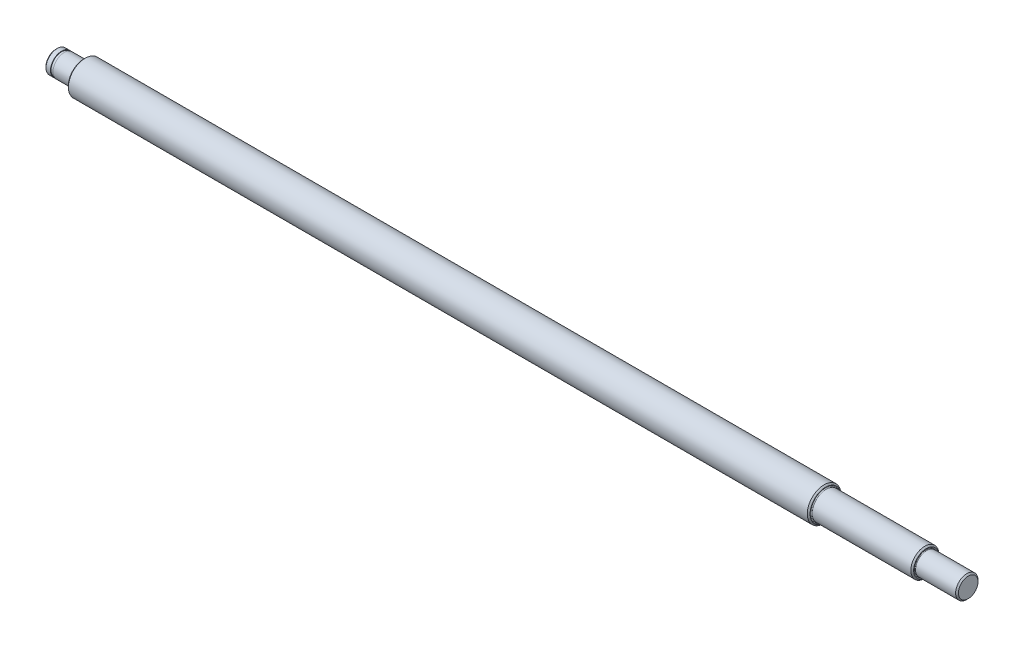
ISO-10303-21;
HEADER;
FILE_DESCRIPTION(('STEP AP214'),'2;1');
FILE_NAME('part.step','',(''),(''),'','','');
FILE_SCHEMA(('AUTOMOTIVE_DESIGN { 1 0 10303 214 1 1 1 1 }'));
ENDSEC;
DATA;
#1=APPLICATION_CONTEXT('core data for automotive mechanical design processes');
#2=APPLICATION_PROTOCOL_DEFINITION('international standard','automotive_design',2000,#1);
#3=PRODUCT_CONTEXT('',#1,'mechanical');
#4=PRODUCT('Part','Part','',(#3));
#5=PRODUCT_RELATED_PRODUCT_CATEGORY('part','',(#4));
#6=PRODUCT_DEFINITION_FORMATION('','',#4);
#7=PRODUCT_DEFINITION_CONTEXT('part definition',#1,'design');
#8=PRODUCT_DEFINITION('design','',#6,#7);
#9=PRODUCT_DEFINITION_SHAPE('','',#8);
#10=(LENGTH_UNIT() NAMED_UNIT(*) SI_UNIT(.MILLI.,.METRE.));
#11=(NAMED_UNIT(*) PLANE_ANGLE_UNIT() SI_UNIT($,.RADIAN.));
#12=(NAMED_UNIT(*) SI_UNIT($,.STERADIAN.) SOLID_ANGLE_UNIT());
#13=UNCERTAINTY_MEASURE_WITH_UNIT(LENGTH_MEASURE(1.E-05),#10,'distance_accuracy_value','');
#14=(GEOMETRIC_REPRESENTATION_CONTEXT(3) GLOBAL_UNCERTAINTY_ASSIGNED_CONTEXT((#13)) GLOBAL_UNIT_ASSIGNED_CONTEXT((#10,
#11,#12)) REPRESENTATION_CONTEXT('',''));
#15=CARTESIAN_POINT('',(0.,0.,0.));
#16=DIRECTION('',(0.,0.,1.));
#17=DIRECTION('',(1.,0.,0.));
#18=AXIS2_PLACEMENT_3D('',#15,#16,#17);
#19=CARTESIAN_POINT('',(0.500000000000004,0.,0.));
#20=DIRECTION('',(1.,0.,0.));
#21=DIRECTION('',(0.,0.,-1.));
#22=AXIS2_PLACEMENT_3D('',#19,#20,#21);
#23=CONICAL_SURFACE('',#22,4.,0.785398163397416);
#24=CARTESIAN_POINT('',(0.,0.,0.));
#25=DIRECTION('',(-1.,0.,0.));
#26=DIRECTION('',(0.,0.,1.));
#27=AXIS2_PLACEMENT_3D('',#24,#25,#26);
#28=CIRCLE('',#27,3.50000000000003);
#29=CARTESIAN_POINT('',(0.,0.,3.50000000000003));
#30=VERTEX_POINT('',#29);
#31=EDGE_CURVE('E104',#30,#30,#28,.T.);
#32=ORIENTED_EDGE('',*,*,#31,.F.);
#33=EDGE_LOOP('',(#32));
#34=FACE_BOUND('',#33,.T.);
#35=CARTESIAN_POINT('',(0.500000000000004,0.,0.));
#36=DIRECTION('',(-1.,0.,0.));
#37=DIRECTION('',(0.,0.,1.));
#38=AXIS2_PLACEMENT_3D('',#35,#36,#37);
#39=CIRCLE('',#38,4.);
#40=CARTESIAN_POINT('',(0.500000000000004,0.,4.));
#41=VERTEX_POINT('',#40);
#42=EDGE_CURVE('E10',#41,#41,#39,.T.);
#43=ORIENTED_EDGE('',*,*,#42,.T.);
#44=EDGE_LOOP('',(#43));
#45=FACE_BOUND('',#44,.T.);
#46=ADVANCED_FACE('F40',(#34,#45),#23,.T.);
#47=CARTESIAN_POINT('',(-20.,0.,0.));
#48=DIRECTION('',(-1.,0.,0.));
#49=DIRECTION('',(0.,0.,1.));
#50=AXIS2_PLACEMENT_3D('',#47,#48,#49);
#51=CYLINDRICAL_SURFACE('',#50,4.);
#52=ORIENTED_EDGE('',*,*,#42,.F.);
#53=EDGE_LOOP('',(#52));
#54=FACE_BOUND('',#53,.T.);
#55=CARTESIAN_POINT('',(2.10000000000001,0.,0.));
#56=DIRECTION('',(-1.,0.,0.));
#57=DIRECTION('',(0.,0.,1.));
#58=AXIS2_PLACEMENT_3D('',#55,#56,#57);
#59=CIRCLE('',#58,4.);
#60=CARTESIAN_POINT('',(2.10000000000001,0.,4.));
#61=VERTEX_POINT('',#60);
#62=EDGE_CURVE('E46',#61,#61,#59,.T.);
#63=ORIENTED_EDGE('',*,*,#62,.T.);
#64=EDGE_LOOP('',(#63));
#65=FACE_BOUND('',#64,.T.);
#66=ADVANCED_FACE('F111',(#54,#65),#51,.T.);
#67=CARTESIAN_POINT('',(2.10000000000001,4.,0.));
#68=DIRECTION('',(-1.,0.,0.));
#69=DIRECTION('',(0.,0.,1.));
#70=AXIS2_PLACEMENT_3D('',#67,#68,#69);
#71=PLANE('',#70);
#72=ORIENTED_EDGE('',*,*,#62,.F.);
#73=EDGE_LOOP('',(#72));
#74=FACE_BOUND('',#73,.T.);
#75=CARTESIAN_POINT('',(2.10000000000001,0.,0.));
#76=DIRECTION('',(-1.,0.,0.));
#77=DIRECTION('',(0.,0.,1.));
#78=AXIS2_PLACEMENT_3D('',#75,#76,#77);
#79=CIRCLE('',#78,3.8);
#80=CARTESIAN_POINT('',(2.10000000000001,0.,3.8));
#81=VERTEX_POINT('',#80);
#82=EDGE_CURVE('E50',#81,#81,#79,.T.);
#83=ORIENTED_EDGE('',*,*,#82,.T.);
#84=EDGE_LOOP('',(#83));
#85=FACE_BOUND('',#84,.T.);
#86=ADVANCED_FACE('F115',(#74,#85),#71,.F.);
#87=CARTESIAN_POINT('',(-20.,0.,0.));
#88=DIRECTION('',(-1.,0.,0.));
#89=DIRECTION('',(0.,0.,1.));
#90=AXIS2_PLACEMENT_3D('',#87,#88,#89);
#91=CYLINDRICAL_SURFACE('',#90,3.8);
#92=ORIENTED_EDGE('',*,*,#82,.F.);
#93=EDGE_LOOP('',(#92));
#94=FACE_BOUND('',#93,.T.);
#95=CARTESIAN_POINT('',(3.00000000000001,0.,0.));
#96=DIRECTION('',(-1.,0.,0.));
#97=DIRECTION('',(0.,0.,1.));
#98=AXIS2_PLACEMENT_3D('',#95,#96,#97);
#99=CIRCLE('',#98,3.8);
#100=CARTESIAN_POINT('',(3.00000000000001,0.,3.8));
#101=VERTEX_POINT('',#100);
#102=EDGE_CURVE('E54',#101,#101,#99,.T.);
#103=ORIENTED_EDGE('',*,*,#102,.T.);
#104=EDGE_LOOP('',(#103));
#105=FACE_BOUND('',#104,.T.);
#106=ADVANCED_FACE('F120',(#94,#105),#91,.T.);
#107=CARTESIAN_POINT('',(3.00000000000001,4.,0.));
#108=DIRECTION('',(1.,0.,0.));
#109=DIRECTION('',(0.,0.,-1.));
#110=AXIS2_PLACEMENT_3D('',#107,#108,#109);
#111=PLANE('',#110);
#112=ORIENTED_EDGE('',*,*,#102,.F.);
#113=EDGE_LOOP('',(#112));
#114=FACE_BOUND('',#113,.T.);
#115=CARTESIAN_POINT('',(3.00000000000001,0.,0.));
#116=DIRECTION('',(-1.,0.,0.));
#117=DIRECTION('',(0.,0.,1.));
#118=AXIS2_PLACEMENT_3D('',#115,#116,#117);
#119=CIRCLE('',#118,4.);
#120=CARTESIAN_POINT('',(3.00000000000001,0.,4.));
#121=VERTEX_POINT('',#120);
#122=EDGE_CURVE('E59',#121,#121,#119,.T.);
#123=ORIENTED_EDGE('',*,*,#122,.T.);
#124=EDGE_LOOP('',(#123));
#125=FACE_BOUND('',#124,.T.);
#126=ADVANCED_FACE('F126',(#114,#125),#111,.F.);
#127=CARTESIAN_POINT('',(-20.,0.,0.));
#128=DIRECTION('',(-1.,0.,0.));
#129=DIRECTION('',(0.,0.,1.));
#130=AXIS2_PLACEMENT_3D('',#127,#128,#129);
#131=CYLINDRICAL_SURFACE('',#130,4.);
#132=ORIENTED_EDGE('',*,*,#122,.F.);
#133=EDGE_LOOP('',(#132));
#134=FACE_BOUND('',#133,.T.);
#135=CARTESIAN_POINT('',(9.70000000000001,0.,0.));
#136=DIRECTION('',(-1.,0.,0.));
#137=DIRECTION('',(0.,0.,1.));
#138=AXIS2_PLACEMENT_3D('',#135,#136,#137);
#139=CIRCLE('',#138,4.);
#140=CARTESIAN_POINT('',(9.70000000000001,0.,4.));
#141=VERTEX_POINT('',#140);
#142=EDGE_CURVE('E62',#141,#141,#139,.T.);
#143=ORIENTED_EDGE('',*,*,#142,.T.);
#144=EDGE_LOOP('',(#143));
#145=FACE_BOUND('',#144,.T.);
#146=ADVANCED_FACE('F130',(#134,#145),#131,.T.);
#147=CARTESIAN_POINT('',(9.70000000000001,0.,0.));
#148=DIRECTION('',(-1.,0.,0.));
#149=DIRECTION('',(0.,0.,1.));
#150=AXIS2_PLACEMENT_3D('',#147,#148,#149);
#151=TOROIDAL_SURFACE('',#150,4.3,0.3);
#152=ORIENTED_EDGE('',*,*,#142,.F.);
#153=EDGE_LOOP('',(#152));
#154=FACE_BOUND('',#153,.T.);
#155=CARTESIAN_POINT('',(10.,0.,0.));
#156=DIRECTION('',(-1.,0.,0.));
#157=DIRECTION('',(0.,0.,1.));
#158=AXIS2_PLACEMENT_3D('',#155,#156,#157);
#159=CIRCLE('',#158,4.3);
#160=CARTESIAN_POINT('',(10.,0.,4.3));
#161=VERTEX_POINT('',#160);
#162=EDGE_CURVE('E65',#161,#161,#159,.T.);
#163=ORIENTED_EDGE('',*,*,#162,.T.);
#164=EDGE_LOOP('',(#163));
#165=FACE_BOUND('',#164,.T.);
#166=ADVANCED_FACE('F134',(#154,#165),#151,.F.);
#167=CARTESIAN_POINT('',(10.,5.50000000000002,0.));
#168=DIRECTION('',(1.,0.,0.));
#169=DIRECTION('',(0.,0.,-1.));
#170=AXIS2_PLACEMENT_3D('',#167,#168,#169);
#171=PLANE('',#170);
#172=ORIENTED_EDGE('',*,*,#162,.F.);
#173=EDGE_LOOP('',(#172));
#174=FACE_BOUND('',#173,.T.);
#175=CARTESIAN_POINT('',(10.,0.,0.));
#176=DIRECTION('',(-1.,0.,0.));
#177=DIRECTION('',(0.,0.,1.));
#178=AXIS2_PLACEMENT_3D('',#175,#176,#177);
#179=CIRCLE('',#178,5.50000000000002);
#180=CARTESIAN_POINT('',(10.,0.,5.50000000000002));
#181=VERTEX_POINT('',#180);
#182=EDGE_CURVE('E68',#181,#181,#179,.T.);
#183=ORIENTED_EDGE('',*,*,#182,.T.);
#184=EDGE_LOOP('',(#183));
#185=FACE_BOUND('',#184,.T.);
#186=ADVANCED_FACE('F138',(#174,#185),#171,.F.);
#187=CARTESIAN_POINT('',(10.5,0.,0.));
#188=DIRECTION('',(1.,0.,0.));
#189=DIRECTION('',(0.,0.,-1.));
#190=AXIS2_PLACEMENT_3D('',#187,#188,#189);
#191=CONICAL_SURFACE('',#190,5.99999999999999,0.785398163397423);
#192=ORIENTED_EDGE('',*,*,#182,.F.);
#193=EDGE_LOOP('',(#192));
#194=FACE_BOUND('',#193,.T.);
#195=CARTESIAN_POINT('',(10.5,0.,0.));
#196=DIRECTION('',(-1.,0.,0.));
#197=DIRECTION('',(0.,0.,1.));
#198=AXIS2_PLACEMENT_3D('',#195,#196,#197);
#199=CIRCLE('',#198,5.99999999999999);
#200=CARTESIAN_POINT('',(10.5,0.,5.99999999999999));
#201=VERTEX_POINT('',#200);
#202=EDGE_CURVE('E71',#201,#201,#199,.T.);
#203=ORIENTED_EDGE('',*,*,#202,.T.);
#204=EDGE_LOOP('',(#203));
#205=FACE_BOUND('',#204,.T.);
#206=ADVANCED_FACE('F142',(#194,#205),#191,.T.);
#207=CARTESIAN_POINT('',(-20.,0.,0.));
#208=DIRECTION('',(-1.,0.,0.));
#209=DIRECTION('',(0.,0.,1.));
#210=AXIS2_PLACEMENT_3D('',#207,#208,#209);
#211=CYLINDRICAL_SURFACE('',#210,6.00000000000002);
#212=ORIENTED_EDGE('',*,*,#202,.F.);
#213=EDGE_LOOP('',(#212));
#214=FACE_BOUND('',#213,.T.);
#215=CARTESIAN_POINT('',(274.5,0.,0.));
#216=DIRECTION('',(-1.,0.,0.));
#217=DIRECTION('',(0.,0.,1.));
#218=AXIS2_PLACEMENT_3D('',#215,#216,#217);
#219=CIRCLE('',#218,6.00000000000005);
#220=CARTESIAN_POINT('',(274.5,0.,6.00000000000005));
#221=VERTEX_POINT('',#220);
#222=EDGE_CURVE('E74',#221,#221,#219,.T.);
#223=ORIENTED_EDGE('',*,*,#222,.T.);
#224=EDGE_LOOP('',(#223));
#225=FACE_BOUND('',#224,.T.);
#226=ADVANCED_FACE('F146',(#214,#225),#211,.T.);
#227=CARTESIAN_POINT('',(275.,0.,0.));
#228=DIRECTION('',(-1.,0.,0.));
#229=DIRECTION('',(0.,0.,1.));
#230=AXIS2_PLACEMENT_3D('',#227,#228,#229);
#231=CONICAL_SURFACE('',#230,5.50000000000002,0.785398163397479);
#232=ORIENTED_EDGE('',*,*,#222,.F.);
#233=EDGE_LOOP('',(#232));
#234=FACE_BOUND('',#233,.T.);
#235=CARTESIAN_POINT('',(275.,0.,0.));
#236=DIRECTION('',(-1.,0.,0.));
#237=DIRECTION('',(0.,0.,1.));
#238=AXIS2_PLACEMENT_3D('',#235,#236,#237);
#239=CIRCLE('',#238,5.50000000000002);
#240=CARTESIAN_POINT('',(275.,0.,5.50000000000002));
#241=VERTEX_POINT('',#240);
#242=EDGE_CURVE('E77',#241,#241,#239,.T.);
#243=ORIENTED_EDGE('',*,*,#242,.T.);
#244=EDGE_LOOP('',(#243));
#245=FACE_BOUND('',#244,.T.);
#246=ADVANCED_FACE('F150',(#234,#245),#231,.T.);
#247=CARTESIAN_POINT('',(275.,5.30000000000003,0.));
#248=DIRECTION('',(-1.,0.,0.));
#249=DIRECTION('',(0.,0.,1.));
#250=AXIS2_PLACEMENT_3D('',#247,#248,#249);
#251=PLANE('',#250);
#252=ORIENTED_EDGE('',*,*,#242,.F.);
#253=EDGE_LOOP('',(#252));
#254=FACE_BOUND('',#253,.T.);
#255=CARTESIAN_POINT('',(275.,0.,0.));
#256=DIRECTION('',(-1.,0.,0.));
#257=DIRECTION('',(0.,0.,1.));
#258=AXIS2_PLACEMENT_3D('',#255,#256,#257);
#259=CIRCLE('',#258,5.30000000000003);
#260=CARTESIAN_POINT('',(275.,0.,5.30000000000003));
#261=VERTEX_POINT('',#260);
#262=EDGE_CURVE('E80',#261,#261,#259,.T.);
#263=ORIENTED_EDGE('',*,*,#262,.T.);
#264=EDGE_LOOP('',(#263));
#265=FACE_BOUND('',#264,.T.);
#266=ADVANCED_FACE('F154',(#254,#265),#251,.F.);
#267=CARTESIAN_POINT('',(275.3,0.,0.));
#268=DIRECTION('',(-1.,0.,0.));
#269=DIRECTION('',(0.,0.,1.));
#270=AXIS2_PLACEMENT_3D('',#267,#268,#269);
#271=TOROIDAL_SURFACE('',#270,5.30000000000003,0.30000000000001);
#272=ORIENTED_EDGE('',*,*,#262,.F.);
#273=EDGE_LOOP('',(#272));
#274=FACE_BOUND('',#273,.T.);
#275=CARTESIAN_POINT('',(275.3,0.,0.));
#276=DIRECTION('',(-1.,0.,0.));
#277=DIRECTION('',(0.,0.,1.));
#278=AXIS2_PLACEMENT_3D('',#275,#276,#277);
#279=CIRCLE('',#278,5.00000000000004);
#280=CARTESIAN_POINT('',(275.3,0.,5.00000000000004));
#281=VERTEX_POINT('',#280);
#282=EDGE_CURVE('E83',#281,#281,#279,.T.);
#283=ORIENTED_EDGE('',*,*,#282,.T.);
#284=EDGE_LOOP('',(#283));
#285=FACE_BOUND('',#284,.T.);
#286=ADVANCED_FACE('F158',(#274,#285),#271,.F.);
#287=CARTESIAN_POINT('',(-20.,0.,0.));
#288=DIRECTION('',(-1.,0.,0.));
#289=DIRECTION('',(0.,0.,1.));
#290=AXIS2_PLACEMENT_3D('',#287,#288,#289);
#291=CYLINDRICAL_SURFACE('',#290,5.00000000000006);
#292=ORIENTED_EDGE('',*,*,#282,.F.);
#293=EDGE_LOOP('',(#292));
#294=FACE_BOUND('',#293,.T.);
#295=CARTESIAN_POINT('',(310.5,0.,0.));
#296=DIRECTION('',(-1.,0.,0.));
#297=DIRECTION('',(0.,0.,1.));
#298=AXIS2_PLACEMENT_3D('',#295,#296,#297);
#299=CIRCLE('',#298,5.0000000000001);
#300=CARTESIAN_POINT('',(310.5,0.,5.0000000000001));
#301=VERTEX_POINT('',#300);
#302=EDGE_CURVE('E86',#301,#301,#299,.T.);
#303=ORIENTED_EDGE('',*,*,#302,.T.);
#304=EDGE_LOOP('',(#303));
#305=FACE_BOUND('',#304,.T.);
#306=ADVANCED_FACE('F162',(#294,#305),#291,.T.);
#307=CARTESIAN_POINT('',(311.,0.,0.));
#308=DIRECTION('',(-1.,0.,0.));
#309=DIRECTION('',(0.,0.,1.));
#310=AXIS2_PLACEMENT_3D('',#307,#308,#309);
#311=CONICAL_SURFACE('',#310,4.50000000000006,0.785398163397479);
#312=ORIENTED_EDGE('',*,*,#302,.F.);
#313=EDGE_LOOP('',(#312));
#314=FACE_BOUND('',#313,.T.);
#315=CARTESIAN_POINT('',(311.,0.,0.));
#316=DIRECTION('',(-1.,0.,0.));
#317=DIRECTION('',(0.,0.,1.));
#318=AXIS2_PLACEMENT_3D('',#315,#316,#317);
#319=CIRCLE('',#318,4.50000000000006);
#320=CARTESIAN_POINT('',(311.,0.,4.50000000000006));
#321=VERTEX_POINT('',#320);
#322=EDGE_CURVE('E89',#321,#321,#319,.T.);
#323=ORIENTED_EDGE('',*,*,#322,.T.);
#324=EDGE_LOOP('',(#323));
#325=FACE_BOUND('',#324,.T.);
#326=ADVANCED_FACE('F166',(#314,#325),#311,.T.);
#327=CARTESIAN_POINT('',(311.,4.20000000000005,0.));
#328=DIRECTION('',(-1.,0.,0.));
#329=DIRECTION('',(0.,0.,1.));
#330=AXIS2_PLACEMENT_3D('',#327,#328,#329);
#331=PLANE('',#330);
#332=ORIENTED_EDGE('',*,*,#322,.F.);
#333=EDGE_LOOP('',(#332));
#334=FACE_BOUND('',#333,.T.);
#335=CARTESIAN_POINT('',(311.,0.,0.));
#336=DIRECTION('',(-1.,0.,0.));
#337=DIRECTION('',(0.,0.,1.));
#338=AXIS2_PLACEMENT_3D('',#335,#336,#337);
#339=CIRCLE('',#338,4.20000000000005);
#340=CARTESIAN_POINT('',(311.,0.,4.20000000000005));
#341=VERTEX_POINT('',#340);
#342=EDGE_CURVE('E92',#341,#341,#339,.T.);
#343=ORIENTED_EDGE('',*,*,#342,.T.);
#344=EDGE_LOOP('',(#343));
#345=FACE_BOUND('',#344,.T.);
#346=ADVANCED_FACE('F170',(#334,#345),#331,.F.);
#347=CARTESIAN_POINT('',(311.2,0.,0.));
#348=DIRECTION('',(-1.,0.,0.));
#349=DIRECTION('',(0.,0.,1.));
#350=AXIS2_PLACEMENT_3D('',#347,#348,#349);
#351=TOROIDAL_SURFACE('',#350,4.20000000000005,0.199999999999989);
#352=ORIENTED_EDGE('',*,*,#342,.F.);
#353=EDGE_LOOP('',(#352));
#354=FACE_BOUND('',#353,.T.);
#355=CARTESIAN_POINT('',(311.2,0.,0.));
#356=DIRECTION('',(-1.,0.,0.));
#357=DIRECTION('',(0.,0.,1.));
#358=AXIS2_PLACEMENT_3D('',#355,#356,#357);
#359=CIRCLE('',#358,4.00000000000005);
#360=CARTESIAN_POINT('',(311.2,0.,4.00000000000005));
#361=VERTEX_POINT('',#360);
#362=EDGE_CURVE('E95',#361,#361,#359,.T.);
#363=ORIENTED_EDGE('',*,*,#362,.T.);
#364=EDGE_LOOP('',(#363));
#365=FACE_BOUND('',#364,.T.);
#366=ADVANCED_FACE('F174',(#354,#365),#351,.F.);
#367=CARTESIAN_POINT('',(-20.,0.,0.));
#368=DIRECTION('',(-1.,0.,0.));
#369=DIRECTION('',(0.,0.,1.));
#370=AXIS2_PLACEMENT_3D('',#367,#368,#369);
#371=CYLINDRICAL_SURFACE('',#370,4.00000000000006);
#372=ORIENTED_EDGE('',*,*,#362,.F.);
#373=EDGE_LOOP('',(#372));
#374=FACE_BOUND('',#373,.T.);
#375=CARTESIAN_POINT('',(325.5,0.,0.));
#376=DIRECTION('',(-1.,0.,0.));
#377=DIRECTION('',(0.,0.,1.));
#378=AXIS2_PLACEMENT_3D('',#375,#376,#377);
#379=CIRCLE('',#378,4.00000000000006);
#380=CARTESIAN_POINT('',(325.5,0.,4.00000000000006));
#381=VERTEX_POINT('',#380);
#382=EDGE_CURVE('E98',#381,#381,#379,.T.);
#383=ORIENTED_EDGE('',*,*,#382,.T.);
#384=EDGE_LOOP('',(#383));
#385=FACE_BOUND('',#384,.T.);
#386=ADVANCED_FACE('F178',(#374,#385),#371,.T.);
#387=CARTESIAN_POINT('',(326.,0.,0.));
#388=DIRECTION('',(-1.,0.,0.));
#389=DIRECTION('',(0.,0.,1.));
#390=AXIS2_PLACEMENT_3D('',#387,#388,#389);
#391=CONICAL_SURFACE('',#390,3.5,0.785398163397562);
#392=ORIENTED_EDGE('',*,*,#382,.F.);
#393=EDGE_LOOP('',(#392));
#394=FACE_BOUND('',#393,.T.);
#395=CARTESIAN_POINT('',(326.,0.,0.));
#396=DIRECTION('',(-1.,0.,0.));
#397=DIRECTION('',(0.,0.,1.));
#398=AXIS2_PLACEMENT_3D('',#395,#396,#397);
#399=CIRCLE('',#398,3.5);
#400=CARTESIAN_POINT('',(326.,0.,3.5));
#401=VERTEX_POINT('',#400);
#402=EDGE_CURVE('E101',#401,#401,#399,.T.);
#403=ORIENTED_EDGE('',*,*,#402,.T.);
#404=EDGE_LOOP('',(#403));
#405=FACE_BOUND('',#404,.T.);
#406=ADVANCED_FACE('F182',(#394,#405),#391,.T.);
#407=CARTESIAN_POINT('',(326.,0.,0.));
#408=DIRECTION('',(-1.,0.,0.));
#409=DIRECTION('',(0.,0.,1.));
#410=AXIS2_PLACEMENT_3D('',#407,#408,#409);
#411=PLANE('',#410);
#412=ORIENTED_EDGE('',*,*,#402,.F.);
#413=EDGE_LOOP('',(#412));
#414=FACE_BOUND('',#413,.T.);
#415=ADVANCED_FACE('F186',(#414),#411,.F.);
#416=CARTESIAN_POINT('',(0.,3.50000000000003,0.));
#417=DIRECTION('',(1.,0.,0.));
#418=DIRECTION('',(0.,0.,-1.));
#419=AXIS2_PLACEMENT_3D('',#416,#417,#418);
#420=PLANE('',#419);
#421=ORIENTED_EDGE('',*,*,#31,.T.);
#422=EDGE_LOOP('',(#421));
#423=FACE_BOUND('',#422,.T.);
#424=ADVANCED_FACE('F108',(#423),#420,.F.);
#425=CLOSED_SHELL('',(#46,#66,#86,#106,#126,#146,#166,#186,#206,#226,#246,#266,#286,#306,#326,
#346,#366,#386,#406,#415,#424));
#426=MANIFOLD_SOLID_BREP('B2',#425);
#427=ADVANCED_BREP_SHAPE_REPRESENTATION('',(#18,#426),#14);
#428=SHAPE_DEFINITION_REPRESENTATION(#9,#427);
ENDSEC;
END-ISO-10303-21;
